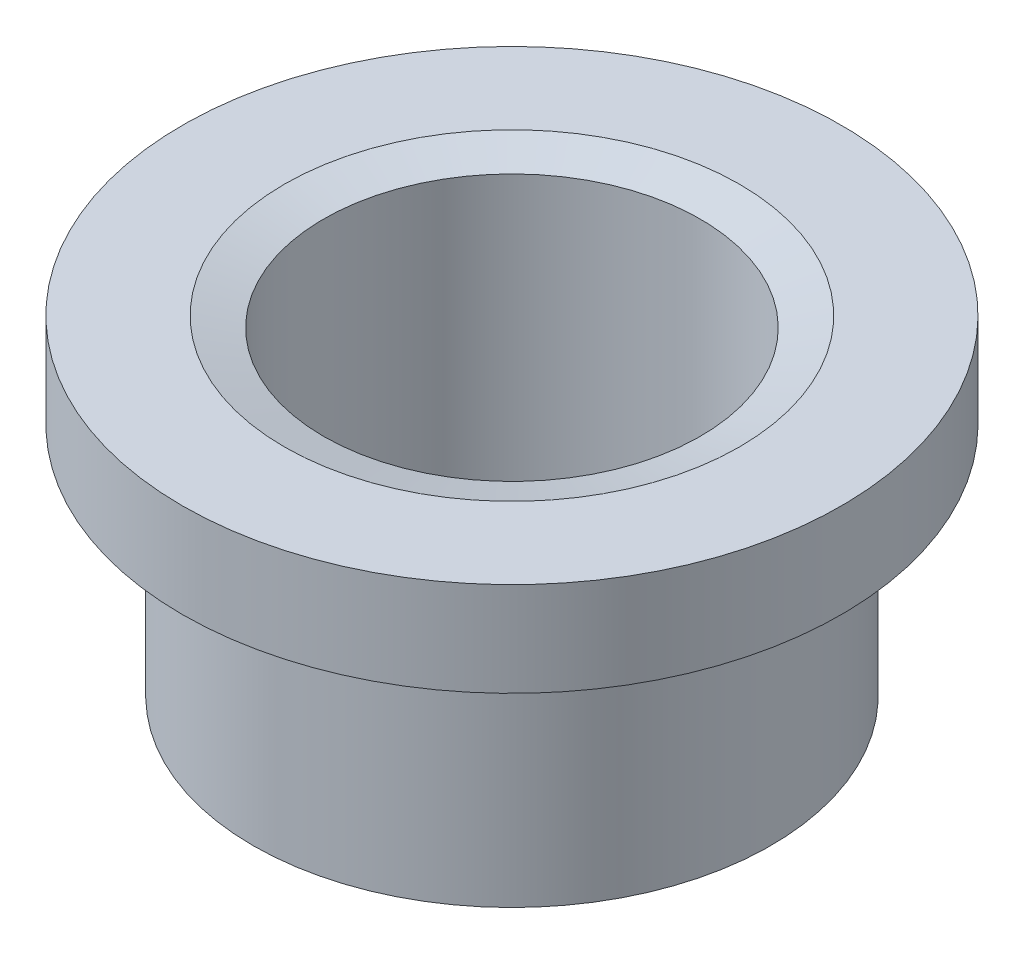
ISO-10303-21;
HEADER;
FILE_DESCRIPTION(('STEP AP214'),'2;1');
FILE_NAME('part.step','',(''),(''),'','','');
FILE_SCHEMA(('AUTOMOTIVE_DESIGN { 1 0 10303 214 1 1 1 1 }'));
ENDSEC;
DATA;
#1=APPLICATION_CONTEXT('core data for automotive mechanical design processes');
#2=APPLICATION_PROTOCOL_DEFINITION('international standard','automotive_design',2000,#1);
#3=PRODUCT_CONTEXT('',#1,'mechanical');
#4=PRODUCT('Part','Part','',(#3));
#5=PRODUCT_RELATED_PRODUCT_CATEGORY('part','',(#4));
#6=PRODUCT_DEFINITION_FORMATION('','',#4);
#7=PRODUCT_DEFINITION_CONTEXT('part definition',#1,'design');
#8=PRODUCT_DEFINITION('design','',#6,#7);
#9=PRODUCT_DEFINITION_SHAPE('','',#8);
#10=(LENGTH_UNIT() NAMED_UNIT(*) SI_UNIT(.MILLI.,.METRE.));
#11=(NAMED_UNIT(*) PLANE_ANGLE_UNIT() SI_UNIT($,.RADIAN.));
#12=(NAMED_UNIT(*) SI_UNIT($,.STERADIAN.) SOLID_ANGLE_UNIT());
#13=UNCERTAINTY_MEASURE_WITH_UNIT(LENGTH_MEASURE(1.E-05),#10,'distance_accuracy_value','');
#14=(GEOMETRIC_REPRESENTATION_CONTEXT(3) GLOBAL_UNCERTAINTY_ASSIGNED_CONTEXT((#13)) GLOBAL_UNIT_ASSIGNED_CONTEXT((#10,
#11,#12)) REPRESENTATION_CONTEXT('',''));
#15=CARTESIAN_POINT('',(0.,0.,0.));
#16=DIRECTION('',(0.,0.,1.));
#17=DIRECTION('',(1.,0.,0.));
#18=AXIS2_PLACEMENT_3D('',#15,#16,#17);
#19=CARTESIAN_POINT('',(0.,15.,0.));
#20=DIRECTION('',(0.,-1.,0.));
#21=DIRECTION('',(0.,0.,-1.));
#22=AXIS2_PLACEMENT_3D('',#19,#20,#21);
#23=CYLINDRICAL_SURFACE('',#22,16.5);
#24=CARTESIAN_POINT('',(0.,15.,0.));
#25=DIRECTION('',(0.,1.,0.));
#26=DIRECTION('',(0.,0.,1.));
#27=AXIS2_PLACEMENT_3D('',#24,#25,#26);
#28=CIRCLE('',#27,16.5);
#29=CARTESIAN_POINT('',(0.,15.,16.5));
#30=VERTEX_POINT('',#29);
#31=EDGE_CURVE('E52',#30,#30,#28,.T.);
#32=ORIENTED_EDGE('',*,*,#31,.F.);
#33=EDGE_LOOP('',(#32));
#34=FACE_BOUND('',#33,.T.);
#35=CARTESIAN_POINT('',(0.,0.,0.));
#36=DIRECTION('',(0.,1.,0.));
#37=DIRECTION('',(0.,0.,1.));
#38=AXIS2_PLACEMENT_3D('',#35,#36,#37);
#39=CIRCLE('',#38,16.5);
#40=CARTESIAN_POINT('',(0.,0.,16.5));
#41=VERTEX_POINT('',#40);
#42=EDGE_CURVE('E57',#41,#41,#39,.T.);
#43=ORIENTED_EDGE('',*,*,#42,.T.);
#44=EDGE_LOOP('',(#43));
#45=FACE_BOUND('',#44,.T.);
#46=ADVANCED_FACE('F38',(#34,#45),#23,.T.);
#47=CARTESIAN_POINT('',(0.,0.,0.));
#48=DIRECTION('',(0.,1.,0.));
#49=DIRECTION('',(0.,0.,1.));
#50=AXIS2_PLACEMENT_3D('',#47,#48,#49);
#51=PLANE('',#50);
#52=CARTESIAN_POINT('',(0.,0.,0.));
#53=DIRECTION('',(0.,1.,0.));
#54=DIRECTION('',(0.,0.,1.));
#55=AXIS2_PLACEMENT_3D('',#52,#53,#54);
#56=CIRCLE('',#55,12.);
#57=CARTESIAN_POINT('',(0.,0.,12.));
#58=VERTEX_POINT('',#57);
#59=EDGE_CURVE('E68',#58,#58,#56,.T.);
#60=ORIENTED_EDGE('',*,*,#59,.T.);
#61=EDGE_LOOP('',(#60));
#62=FACE_BOUND('',#61,.T.);
#63=ORIENTED_EDGE('',*,*,#42,.F.);
#64=EDGE_LOOP('',(#63));
#65=FACE_BOUND('',#64,.T.);
#66=ADVANCED_FACE('F76',(#62,#65),#51,.F.);
#67=CARTESIAN_POINT('',(0.,21.,0.));
#68=DIRECTION('',(0.,-1.,0.));
#69=DIRECTION('',(0.,0.,-1.));
#70=AXIS2_PLACEMENT_3D('',#67,#68,#69);
#71=CYLINDRICAL_SURFACE('',#70,21.);
#72=CARTESIAN_POINT('',(0.,21.,0.));
#73=DIRECTION('',(0.,1.,0.));
#74=DIRECTION('',(0.,0.,1.));
#75=AXIS2_PLACEMENT_3D('',#72,#73,#74);
#76=CIRCLE('',#75,21.);
#77=CARTESIAN_POINT('',(0.,21.,21.));
#78=VERTEX_POINT('',#77);
#79=EDGE_CURVE('E62',#78,#78,#76,.T.);
#80=ORIENTED_EDGE('',*,*,#79,.F.);
#81=EDGE_LOOP('',(#80));
#82=FACE_BOUND('',#81,.T.);
#83=CARTESIAN_POINT('',(0.,15.,0.));
#84=DIRECTION('',(0.,1.,0.));
#85=DIRECTION('',(0.,0.,1.));
#86=AXIS2_PLACEMENT_3D('',#83,#84,#85);
#87=CIRCLE('',#86,21.);
#88=CARTESIAN_POINT('',(0.,15.,21.));
#89=VERTEX_POINT('',#88);
#90=EDGE_CURVE('E64',#89,#89,#87,.T.);
#91=ORIENTED_EDGE('',*,*,#90,.T.);
#92=EDGE_LOOP('',(#91));
#93=FACE_BOUND('',#92,.T.);
#94=ADVANCED_FACE('F100',(#82,#93),#71,.T.);
#95=CARTESIAN_POINT('',(0.,21.,0.));
#96=DIRECTION('',(0.,1.,0.));
#97=DIRECTION('',(0.,0.,1.));
#98=AXIS2_PLACEMENT_3D('',#95,#96,#97);
#99=PLANE('',#98);
#100=CARTESIAN_POINT('',(0.,21.,0.));
#101=DIRECTION('',(0.,1.,0.));
#102=DIRECTION('',(0.,0.,1.));
#103=AXIS2_PLACEMENT_3D('',#100,#101,#102);
#104=CIRCLE('',#103,14.5);
#105=CARTESIAN_POINT('',(0.,21.,14.5));
#106=VERTEX_POINT('',#105);
#107=EDGE_CURVE('E10',#106,#106,#104,.F.);
#108=ORIENTED_EDGE('',*,*,#107,.T.);
#109=EDGE_LOOP('',(#108));
#110=FACE_BOUND('',#109,.T.);
#111=ORIENTED_EDGE('',*,*,#79,.T.);
#112=EDGE_LOOP('',(#111));
#113=FACE_BOUND('',#112,.T.);
#114=ADVANCED_FACE('F90',(#110,#113),#99,.T.);
#115=CARTESIAN_POINT('',(0.,15.,0.));
#116=DIRECTION('',(0.,1.,0.));
#117=DIRECTION('',(0.,0.,1.));
#118=AXIS2_PLACEMENT_3D('',#115,#116,#117);
#119=PLANE('',#118);
#120=ORIENTED_EDGE('',*,*,#31,.T.);
#121=EDGE_LOOP('',(#120));
#122=FACE_BOUND('',#121,.T.);
#123=ORIENTED_EDGE('',*,*,#90,.F.);
#124=EDGE_LOOP('',(#123));
#125=FACE_BOUND('',#124,.T.);
#126=ADVANCED_FACE('F81',(#122,#125),#119,.F.);
#127=CARTESIAN_POINT('',(0.,0.,0.));
#128=DIRECTION('',(0.,1.,0.));
#129=DIRECTION('',(0.,0.,1.));
#130=AXIS2_PLACEMENT_3D('',#127,#128,#129);
#131=CYLINDRICAL_SURFACE('',#130,12.);
#132=CARTESIAN_POINT('',(0.,20.3301270189222,0.));
#133=DIRECTION('',(0.,1.,0.));
#134=DIRECTION('',(0.,0.,1.));
#135=AXIS2_PLACEMENT_3D('',#132,#133,#134);
#136=CIRCLE('',#135,12.);
#137=CARTESIAN_POINT('',(0.,20.3301270189222,12.));
#138=VERTEX_POINT('',#137);
#139=EDGE_CURVE('E47',#138,#138,#136,.T.);
#140=ORIENTED_EDGE('',*,*,#139,.T.);
#141=EDGE_LOOP('',(#140));
#142=FACE_BOUND('',#141,.T.);
#143=ORIENTED_EDGE('',*,*,#59,.F.);
#144=EDGE_LOOP('',(#143));
#145=FACE_BOUND('',#144,.T.);
#146=ADVANCED_FACE('F79',(#142,#145),#131,.F.);
#147=CARTESIAN_POINT('',(0.,20.3301270189222,0.));
#148=DIRECTION('',(0.,1.,0.));
#149=DIRECTION('',(0.,0.,1.));
#150=AXIS2_PLACEMENT_3D('',#147,#148,#149);
#151=CONICAL_SURFACE('',#150,12.,1.30899693899575);
#152=ORIENTED_EDGE('',*,*,#107,.F.);
#153=EDGE_LOOP('',(#152));
#154=FACE_BOUND('',#153,.T.);
#155=ORIENTED_EDGE('',*,*,#139,.F.);
#156=EDGE_LOOP('',(#155));
#157=FACE_BOUND('',#156,.T.);
#158=ADVANCED_FACE('F41',(#154,#157),#151,.F.);
#159=CLOSED_SHELL('',(#46,#66,#94,#114,#126,#146,#158));
#160=MANIFOLD_SOLID_BREP('B2',#159);
#161=ADVANCED_BREP_SHAPE_REPRESENTATION('',(#18,#160),#14);
#162=SHAPE_DEFINITION_REPRESENTATION(#9,#161);
ENDSEC;
END-ISO-10303-21;
